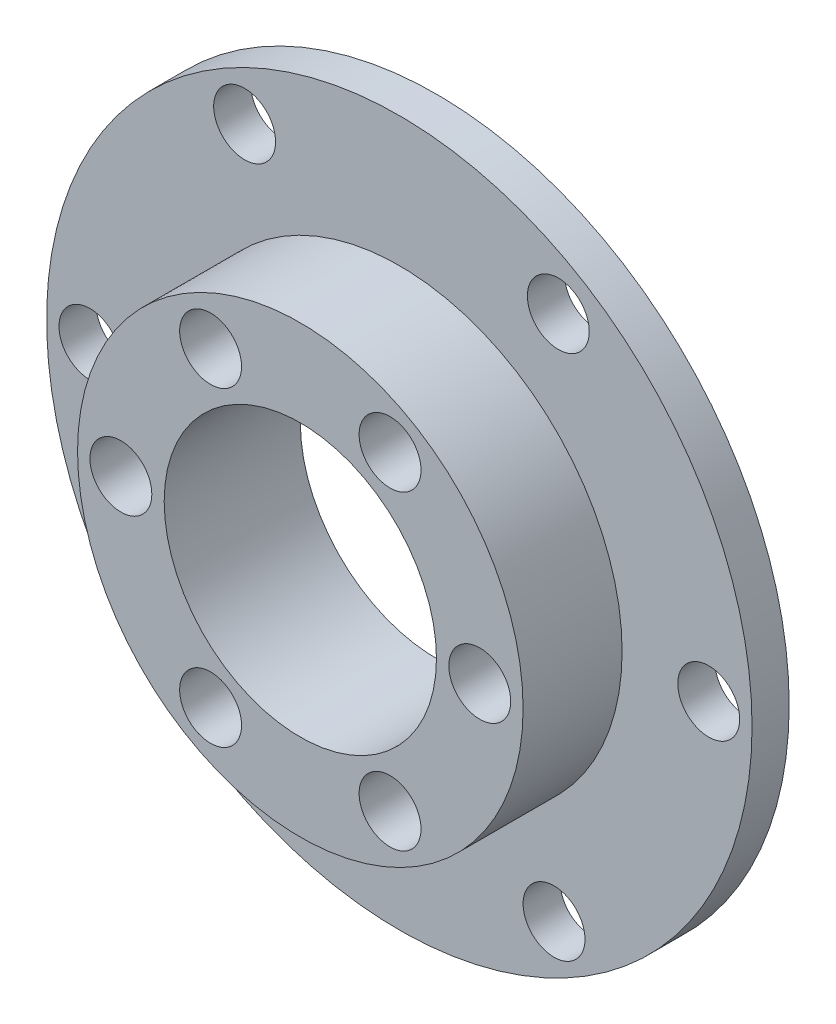
ISO-10303-21;
HEADER;
FILE_DESCRIPTION(('STEP AP214'),'2;1');
FILE_NAME('part.step','',(''),(''),'','','');
FILE_SCHEMA(('AUTOMOTIVE_DESIGN { 1 0 10303 214 1 1 1 1 }'));
ENDSEC;
DATA;
#1=APPLICATION_CONTEXT('core data for automotive mechanical design processes');
#2=APPLICATION_PROTOCOL_DEFINITION('international standard','automotive_design',2000,#1);
#3=PRODUCT_CONTEXT('',#1,'mechanical');
#4=PRODUCT('Part','Part','',(#3));
#5=PRODUCT_RELATED_PRODUCT_CATEGORY('part','',(#4));
#6=PRODUCT_DEFINITION_FORMATION('','',#4);
#7=PRODUCT_DEFINITION_CONTEXT('part definition',#1,'design');
#8=PRODUCT_DEFINITION('design','',#6,#7);
#9=PRODUCT_DEFINITION_SHAPE('','',#8);
#10=(LENGTH_UNIT() NAMED_UNIT(*) SI_UNIT(.MILLI.,.METRE.));
#11=(NAMED_UNIT(*) PLANE_ANGLE_UNIT() SI_UNIT($,.RADIAN.));
#12=(NAMED_UNIT(*) SI_UNIT($,.STERADIAN.) SOLID_ANGLE_UNIT());
#13=UNCERTAINTY_MEASURE_WITH_UNIT(LENGTH_MEASURE(1.E-05),#10,'distance_accuracy_value','');
#14=(GEOMETRIC_REPRESENTATION_CONTEXT(3) GLOBAL_UNCERTAINTY_ASSIGNED_CONTEXT((#13)) GLOBAL_UNIT_ASSIGNED_CONTEXT((#10,
#11,#12)) REPRESENTATION_CONTEXT('',''));
#15=CARTESIAN_POINT('',(0.,0.,0.));
#16=DIRECTION('',(0.,0.,1.));
#17=DIRECTION('',(1.,0.,0.));
#18=AXIS2_PLACEMENT_3D('',#15,#16,#17);
#19=CARTESIAN_POINT('',(0.,0.,3.));
#20=DIRECTION('',(0.,0.,1.));
#21=DIRECTION('',(1.,0.,0.));
#22=AXIS2_PLACEMENT_3D('',#19,#20,#21);
#23=PLANE('',#22);
#24=CARTESIAN_POINT('',(0.,0.,3.));
#25=DIRECTION('',(0.,0.,1.));
#26=DIRECTION('',(1.,0.,0.));
#27=AXIS2_PLACEMENT_3D('',#24,#25,#26);
#28=CIRCLE('',#27,28.5);
#29=CARTESIAN_POINT('',(28.5,0.,3.));
#30=VERTEX_POINT('',#29);
#31=EDGE_CURVE('E10',#30,#30,#28,.T.);
#32=ORIENTED_EDGE('',*,*,#31,.T.);
#33=EDGE_LOOP('',(#32));
#34=FACE_BOUND('',#33,.T.);
#35=CARTESIAN_POINT('',(-12.5000000000003,21.6506350946108,3.));
#36=DIRECTION('',(0.,0.,1.));
#37=DIRECTION('',(1.,0.,0.));
#38=AXIS2_PLACEMENT_3D('',#35,#36,#37);
#39=CIRCLE('',#38,2.5);
#40=CARTESIAN_POINT('',(-10.0000000000003,21.6506350946108,3.));
#41=VERTEX_POINT('',#40);
#42=EDGE_CURVE('E41',#41,#41,#39,.T.);
#43=ORIENTED_EDGE('',*,*,#42,.F.);
#44=EDGE_LOOP('',(#43));
#45=FACE_BOUND('',#44,.T.);
#46=CARTESIAN_POINT('',(-25.,0.,3.));
#47=DIRECTION('',(0.,0.,1.));
#48=DIRECTION('',(1.,0.,0.));
#49=AXIS2_PLACEMENT_3D('',#46,#47,#48);
#50=CIRCLE('',#49,2.5);
#51=CARTESIAN_POINT('',(-22.5,0.,3.));
#52=VERTEX_POINT('',#51);
#53=EDGE_CURVE('E46',#52,#52,#50,.T.);
#54=ORIENTED_EDGE('',*,*,#53,.F.);
#55=EDGE_LOOP('',(#54));
#56=FACE_BOUND('',#55,.T.);
#57=CARTESIAN_POINT('',(12.8460455766763,21.0512665740729,3.));
#58=DIRECTION('',(0.,0.,1.));
#59=DIRECTION('',(1.,0.,0.));
#60=AXIS2_PLACEMENT_3D('',#57,#58,#59);
#61=CIRCLE('',#60,2.5);
#62=CARTESIAN_POINT('',(15.3460455766763,21.0512665740729,3.));
#63=VERTEX_POINT('',#62);
#64=EDGE_CURVE('E108',#63,#63,#61,.T.);
#65=ORIENTED_EDGE('',*,*,#64,.F.);
#66=EDGE_LOOP('',(#65));
#67=FACE_BOUND('',#66,.T.);
#68=CARTESIAN_POINT('',(25.,1.74574066942157E-13,3.));
#69=DIRECTION('',(0.,0.,1.));
#70=DIRECTION('',(1.,0.,0.));
#71=AXIS2_PLACEMENT_3D('',#68,#69,#70);
#72=CIRCLE('',#71,2.5);
#73=CARTESIAN_POINT('',(27.5,1.74574066942157E-13,3.));
#74=VERTEX_POINT('',#73);
#75=EDGE_CURVE('E100',#74,#74,#72,.T.);
#76=ORIENTED_EDGE('',*,*,#75,.F.);
#77=EDGE_LOOP('',(#76));
#78=FACE_BOUND('',#77,.T.);
#79=CARTESIAN_POINT('',(12.5000000000001,-21.6506350946109,3.));
#80=DIRECTION('',(0.,0.,1.));
#81=DIRECTION('',(1.,0.,0.));
#82=AXIS2_PLACEMENT_3D('',#79,#80,#81);
#83=CIRCLE('',#82,2.5);
#84=CARTESIAN_POINT('',(15.0000000000001,-21.6506350946109,3.));
#85=VERTEX_POINT('',#84);
#86=EDGE_CURVE('E95',#85,#85,#83,.T.);
#87=ORIENTED_EDGE('',*,*,#86,.F.);
#88=EDGE_LOOP('',(#87));
#89=FACE_BOUND('',#88,.T.);
#90=CARTESIAN_POINT('',(-12.5,-21.650635094611,3.));
#91=DIRECTION('',(0.,0.,1.));
#92=DIRECTION('',(1.,0.,0.));
#93=AXIS2_PLACEMENT_3D('',#90,#91,#92);
#94=CIRCLE('',#93,2.5);
#95=CARTESIAN_POINT('',(-9.99999999999995,-21.650635094611,3.));
#96=VERTEX_POINT('',#95);
#97=EDGE_CURVE('E91',#96,#96,#94,.T.);
#98=ORIENTED_EDGE('',*,*,#97,.F.);
#99=EDGE_LOOP('',(#98));
#100=FACE_BOUND('',#99,.T.);
#101=CARTESIAN_POINT('',(0.,0.,3.));
#102=DIRECTION('',(0.,0.,1.));
#103=DIRECTION('',(1.,0.,0.));
#104=AXIS2_PLACEMENT_3D('',#101,#102,#103);
#105=CIRCLE('',#104,18.);
#106=CARTESIAN_POINT('',(18.,0.,3.));
#107=VERTEX_POINT('',#106);
#108=EDGE_CURVE('E103',#107,#107,#105,.T.);
#109=ORIENTED_EDGE('',*,*,#108,.F.);
#110=EDGE_LOOP('',(#109));
#111=FACE_BOUND('',#110,.T.);
#112=ADVANCED_FACE('F33',(#34,#45,#56,#67,#78,#89,#100,#111),#23,.T.);
#113=CARTESIAN_POINT('',(7.25000000000006,-12.5573683548743,3.));
#114=DIRECTION('',(0.,0.,-1.));
#115=DIRECTION('',(-1.,0.,0.));
#116=AXIS2_PLACEMENT_3D('',#113,#114,#115);
#117=CYLINDRICAL_SURFACE('',#116,2.5);
#118=CARTESIAN_POINT('',(7.25000000000006,-12.5573683548743,0.));
#119=DIRECTION('',(0.,0.,1.));
#120=DIRECTION('',(1.,0.,0.));
#121=AXIS2_PLACEMENT_3D('',#118,#119,#120);
#122=CIRCLE('',#121,2.5);
#123=CARTESIAN_POINT('',(9.75000000000006,-12.5573683548743,0.));
#124=VERTEX_POINT('',#123);
#125=EDGE_CURVE('E86',#124,#124,#122,.T.);
#126=ORIENTED_EDGE('',*,*,#125,.F.);
#127=EDGE_LOOP('',(#126));
#128=FACE_BOUND('',#127,.T.);
#129=CARTESIAN_POINT('',(7.25000000000006,-12.5573683548743,11.));
#130=DIRECTION('',(0.,0.,1.));
#131=DIRECTION('',(1.,0.,0.));
#132=AXIS2_PLACEMENT_3D('',#129,#130,#131);
#133=CIRCLE('',#132,2.5);
#134=CARTESIAN_POINT('',(9.75000000000006,-12.5573683548743,11.));
#135=VERTEX_POINT('',#134);
#136=EDGE_CURVE('E149',#135,#135,#133,.T.);
#137=ORIENTED_EDGE('',*,*,#136,.T.);
#138=EDGE_LOOP('',(#137));
#139=FACE_BOUND('',#138,.T.);
#140=ADVANCED_FACE('F118',(#128,#139),#117,.F.);
#141=CARTESIAN_POINT('',(14.5,1.01252958826451E-13,3.));
#142=DIRECTION('',(0.,0.,-1.));
#143=DIRECTION('',(-1.,0.,0.));
#144=AXIS2_PLACEMENT_3D('',#141,#142,#143);
#145=CYLINDRICAL_SURFACE('',#144,2.5);
#146=CARTESIAN_POINT('',(14.5,1.01252958826451E-13,0.));
#147=DIRECTION('',(0.,0.,1.));
#148=DIRECTION('',(1.,0.,0.));
#149=AXIS2_PLACEMENT_3D('',#146,#147,#148);
#150=CIRCLE('',#149,2.5);
#151=CARTESIAN_POINT('',(17.,1.01252958826451E-13,0.));
#152=VERTEX_POINT('',#151);
#153=EDGE_CURVE('E84',#152,#152,#150,.T.);
#154=ORIENTED_EDGE('',*,*,#153,.F.);
#155=EDGE_LOOP('',(#154));
#156=FACE_BOUND('',#155,.T.);
#157=CARTESIAN_POINT('',(14.5,1.01252958826451E-13,11.));
#158=DIRECTION('',(0.,0.,1.));
#159=DIRECTION('',(1.,0.,0.));
#160=AXIS2_PLACEMENT_3D('',#157,#158,#159);
#161=CIRCLE('',#160,2.5);
#162=CARTESIAN_POINT('',(17.,1.01252958826451E-13,11.));
#163=VERTEX_POINT('',#162);
#164=EDGE_CURVE('E146',#163,#163,#161,.T.);
#165=ORIENTED_EDGE('',*,*,#164,.T.);
#166=EDGE_LOOP('',(#165));
#167=FACE_BOUND('',#166,.T.);
#168=ADVANCED_FACE('F180',(#156,#167),#145,.F.);
#169=CARTESIAN_POINT('',(-14.5,0.,3.));
#170=DIRECTION('',(0.,0.,-1.));
#171=DIRECTION('',(-1.,0.,0.));
#172=AXIS2_PLACEMENT_3D('',#169,#170,#171);
#173=CYLINDRICAL_SURFACE('',#172,2.5);
#174=CARTESIAN_POINT('',(-14.5,0.,0.));
#175=DIRECTION('',(0.,0.,1.));
#176=DIRECTION('',(1.,0.,0.));
#177=AXIS2_PLACEMENT_3D('',#174,#175,#176);
#178=CIRCLE('',#177,2.5);
#179=CARTESIAN_POINT('',(-12.,0.,0.));
#180=VERTEX_POINT('',#179);
#181=EDGE_CURVE('E81',#180,#180,#178,.T.);
#182=ORIENTED_EDGE('',*,*,#181,.F.);
#183=EDGE_LOOP('',(#182));
#184=FACE_BOUND('',#183,.T.);
#185=CARTESIAN_POINT('',(-14.5,0.,11.));
#186=DIRECTION('',(0.,0.,1.));
#187=DIRECTION('',(1.,0.,0.));
#188=AXIS2_PLACEMENT_3D('',#185,#186,#187);
#189=CIRCLE('',#188,2.5);
#190=CARTESIAN_POINT('',(-12.,0.,11.));
#191=VERTEX_POINT('',#190);
#192=EDGE_CURVE('E133',#191,#191,#189,.T.);
#193=ORIENTED_EDGE('',*,*,#192,.T.);
#194=EDGE_LOOP('',(#193));
#195=FACE_BOUND('',#194,.T.);
#196=ADVANCED_FACE('F184',(#184,#195),#173,.F.);
#197=CARTESIAN_POINT('',(7.24999999999988,12.5573683548744,3.));
#198=DIRECTION('',(0.,0.,-1.));
#199=DIRECTION('',(-1.,0.,0.));
#200=AXIS2_PLACEMENT_3D('',#197,#198,#199);
#201=CYLINDRICAL_SURFACE('',#200,2.5);
#202=CARTESIAN_POINT('',(7.24999999999988,12.5573683548744,0.));
#203=DIRECTION('',(0.,0.,1.));
#204=DIRECTION('',(1.,0.,0.));
#205=AXIS2_PLACEMENT_3D('',#202,#203,#204);
#206=CIRCLE('',#205,2.5);
#207=CARTESIAN_POINT('',(9.74999999999988,12.5573683548744,0.));
#208=VERTEX_POINT('',#207);
#209=EDGE_CURVE('E78',#208,#208,#206,.T.);
#210=ORIENTED_EDGE('',*,*,#209,.F.);
#211=EDGE_LOOP('',(#210));
#212=FACE_BOUND('',#211,.T.);
#213=CARTESIAN_POINT('',(7.24999999999988,12.5573683548744,11.));
#214=DIRECTION('',(0.,0.,1.));
#215=DIRECTION('',(1.,0.,0.));
#216=AXIS2_PLACEMENT_3D('',#213,#214,#215);
#217=CIRCLE('',#216,2.5);
#218=CARTESIAN_POINT('',(9.74999999999988,12.5573683548744,11.));
#219=VERTEX_POINT('',#218);
#220=EDGE_CURVE('E143',#219,#219,#217,.T.);
#221=ORIENTED_EDGE('',*,*,#220,.T.);
#222=EDGE_LOOP('',(#221));
#223=FACE_BOUND('',#222,.T.);
#224=ADVANCED_FACE('F188',(#212,#223),#201,.F.);
#225=CARTESIAN_POINT('',(-7.25000000000015,12.5573683548743,3.));
#226=DIRECTION('',(0.,0.,-1.));
#227=DIRECTION('',(-1.,0.,0.));
#228=AXIS2_PLACEMENT_3D('',#225,#226,#227);
#229=CYLINDRICAL_SURFACE('',#228,2.5);
#230=CARTESIAN_POINT('',(-7.25000000000015,12.5573683548743,0.));
#231=DIRECTION('',(0.,0.,1.));
#232=DIRECTION('',(1.,0.,0.));
#233=AXIS2_PLACEMENT_3D('',#230,#231,#232);
#234=CIRCLE('',#233,2.5);
#235=CARTESIAN_POINT('',(-4.75000000000015,12.5573683548743,0.));
#236=VERTEX_POINT('',#235);
#237=EDGE_CURVE('E75',#236,#236,#234,.T.);
#238=ORIENTED_EDGE('',*,*,#237,.F.);
#239=EDGE_LOOP('',(#238));
#240=FACE_BOUND('',#239,.T.);
#241=CARTESIAN_POINT('',(-7.25000000000015,12.5573683548743,11.));
#242=DIRECTION('',(0.,0.,1.));
#243=DIRECTION('',(1.,0.,0.));
#244=AXIS2_PLACEMENT_3D('',#241,#242,#243);
#245=CIRCLE('',#244,2.5);
#246=CARTESIAN_POINT('',(-4.75000000000015,12.5573683548743,11.));
#247=VERTEX_POINT('',#246);
#248=EDGE_CURVE('E138',#247,#247,#245,.T.);
#249=ORIENTED_EDGE('',*,*,#248,.T.);
#250=EDGE_LOOP('',(#249));
#251=FACE_BOUND('',#250,.T.);
#252=ADVANCED_FACE('F192',(#240,#251),#229,.F.);
#253=CARTESIAN_POINT('',(0.,0.,3.));
#254=DIRECTION('',(0.,0.,-1.));
#255=DIRECTION('',(-1.,0.,0.));
#256=AXIS2_PLACEMENT_3D('',#253,#254,#255);
#257=CYLINDRICAL_SURFACE('',#256,11.);
#258=CARTESIAN_POINT('',(0.,0.,0.));
#259=DIRECTION('',(0.,0.,1.));
#260=DIRECTION('',(1.,0.,0.));
#261=AXIS2_PLACEMENT_3D('',#258,#259,#260);
#262=CIRCLE('',#261,11.);
#263=CARTESIAN_POINT('',(11.,0.,0.));
#264=VERTEX_POINT('',#263);
#265=EDGE_CURVE('E72',#264,#264,#262,.T.);
#266=ORIENTED_EDGE('',*,*,#265,.F.);
#267=EDGE_LOOP('',(#266));
#268=FACE_BOUND('',#267,.T.);
#269=CARTESIAN_POINT('',(0.,0.,11.));
#270=DIRECTION('',(0.,0.,1.));
#271=DIRECTION('',(1.,0.,0.));
#272=AXIS2_PLACEMENT_3D('',#269,#270,#271);
#273=CIRCLE('',#272,11.);
#274=CARTESIAN_POINT('',(11.,0.,11.));
#275=VERTEX_POINT('',#274);
#276=EDGE_CURVE('E130',#275,#275,#273,.T.);
#277=ORIENTED_EDGE('',*,*,#276,.T.);
#278=EDGE_LOOP('',(#277));
#279=FACE_BOUND('',#278,.T.);
#280=ADVANCED_FACE('F196',(#268,#279),#257,.F.);
#281=CARTESIAN_POINT('',(0.,0.,3.));
#282=DIRECTION('',(0.,0.,-1.));
#283=DIRECTION('',(-1.,0.,0.));
#284=AXIS2_PLACEMENT_3D('',#281,#282,#283);
#285=CYLINDRICAL_SURFACE('',#284,28.5);
#286=ORIENTED_EDGE('',*,*,#31,.F.);
#287=EDGE_LOOP('',(#286));
#288=FACE_BOUND('',#287,.T.);
#289=CARTESIAN_POINT('',(0.,0.,0.));
#290=DIRECTION('',(0.,0.,1.));
#291=DIRECTION('',(1.,0.,0.));
#292=AXIS2_PLACEMENT_3D('',#289,#290,#291);
#293=CIRCLE('',#292,28.5);
#294=CARTESIAN_POINT('',(28.5,0.,0.));
#295=VERTEX_POINT('',#294);
#296=EDGE_CURVE('E69',#295,#295,#293,.T.);
#297=ORIENTED_EDGE('',*,*,#296,.T.);
#298=EDGE_LOOP('',(#297));
#299=FACE_BOUND('',#298,.T.);
#300=ADVANCED_FACE('F200',(#288,#299),#285,.T.);
#301=CARTESIAN_POINT('',(-12.5000000000003,21.6506350946108,3.));
#302=DIRECTION('',(0.,0.,-1.));
#303=DIRECTION('',(-1.,0.,0.));
#304=AXIS2_PLACEMENT_3D('',#301,#302,#303);
#305=CYLINDRICAL_SURFACE('',#304,2.5);
#306=ORIENTED_EDGE('',*,*,#42,.T.);
#307=EDGE_LOOP('',(#306));
#308=FACE_BOUND('',#307,.T.);
#309=CARTESIAN_POINT('',(-12.5000000000003,21.6506350946108,0.));
#310=DIRECTION('',(0.,0.,1.));
#311=DIRECTION('',(1.,0.,0.));
#312=AXIS2_PLACEMENT_3D('',#309,#310,#311);
#313=CIRCLE('',#312,2.5);
#314=CARTESIAN_POINT('',(-10.0000000000003,21.6506350946108,0.));
#315=VERTEX_POINT('',#314);
#316=EDGE_CURVE('E66',#315,#315,#313,.T.);
#317=ORIENTED_EDGE('',*,*,#316,.F.);
#318=EDGE_LOOP('',(#317));
#319=FACE_BOUND('',#318,.T.);
#320=ADVANCED_FACE('F204',(#308,#319),#305,.F.);
#321=CARTESIAN_POINT('',(-25.,0.,3.));
#322=DIRECTION('',(0.,0.,-1.));
#323=DIRECTION('',(-1.,0.,0.));
#324=AXIS2_PLACEMENT_3D('',#321,#322,#323);
#325=CYLINDRICAL_SURFACE('',#324,2.5);
#326=ORIENTED_EDGE('',*,*,#53,.T.);
#327=EDGE_LOOP('',(#326));
#328=FACE_BOUND('',#327,.T.);
#329=CARTESIAN_POINT('',(-25.,0.,0.));
#330=DIRECTION('',(0.,0.,1.));
#331=DIRECTION('',(1.,0.,0.));
#332=AXIS2_PLACEMENT_3D('',#329,#330,#331);
#333=CIRCLE('',#332,2.5);
#334=CARTESIAN_POINT('',(-22.5,0.,0.));
#335=VERTEX_POINT('',#334);
#336=EDGE_CURVE('E63',#335,#335,#333,.T.);
#337=ORIENTED_EDGE('',*,*,#336,.F.);
#338=EDGE_LOOP('',(#337));
#339=FACE_BOUND('',#338,.T.);
#340=ADVANCED_FACE('F113',(#328,#339),#325,.F.);
#341=CARTESIAN_POINT('',(12.8460455766763,21.0512665740729,3.));
#342=DIRECTION('',(0.,0.,-1.));
#343=DIRECTION('',(-1.,0.,0.));
#344=AXIS2_PLACEMENT_3D('',#341,#342,#343);
#345=CYLINDRICAL_SURFACE('',#344,2.5);
#346=ORIENTED_EDGE('',*,*,#64,.T.);
#347=EDGE_LOOP('',(#346));
#348=FACE_BOUND('',#347,.T.);
#349=CARTESIAN_POINT('',(12.8460455766763,21.0512665740729,0.));
#350=DIRECTION('',(0.,0.,1.));
#351=DIRECTION('',(1.,0.,0.));
#352=AXIS2_PLACEMENT_3D('',#349,#350,#351);
#353=CIRCLE('',#352,2.5);
#354=CARTESIAN_POINT('',(15.3460455766763,21.0512665740729,0.));
#355=VERTEX_POINT('',#354);
#356=EDGE_CURVE('E60',#355,#355,#353,.T.);
#357=ORIENTED_EDGE('',*,*,#356,.F.);
#358=EDGE_LOOP('',(#357));
#359=FACE_BOUND('',#358,.T.);
#360=ADVANCED_FACE('F211',(#348,#359),#345,.F.);
#361=CARTESIAN_POINT('',(25.,1.74574066942157E-13,3.));
#362=DIRECTION('',(0.,0.,-1.));
#363=DIRECTION('',(-1.,0.,0.));
#364=AXIS2_PLACEMENT_3D('',#361,#362,#363);
#365=CYLINDRICAL_SURFACE('',#364,2.5);
#366=ORIENTED_EDGE('',*,*,#75,.T.);
#367=EDGE_LOOP('',(#366));
#368=FACE_BOUND('',#367,.T.);
#369=CARTESIAN_POINT('',(25.,1.74574066942157E-13,0.));
#370=DIRECTION('',(0.,0.,1.));
#371=DIRECTION('',(1.,0.,0.));
#372=AXIS2_PLACEMENT_3D('',#369,#370,#371);
#373=CIRCLE('',#372,2.5);
#374=CARTESIAN_POINT('',(27.5,1.74574066942157E-13,0.));
#375=VERTEX_POINT('',#374);
#376=EDGE_CURVE('E57',#375,#375,#373,.T.);
#377=ORIENTED_EDGE('',*,*,#376,.F.);
#378=EDGE_LOOP('',(#377));
#379=FACE_BOUND('',#378,.T.);
#380=ADVANCED_FACE('F214',(#368,#379),#365,.F.);
#381=CARTESIAN_POINT('',(12.5000000000001,-21.6506350946109,3.));
#382=DIRECTION('',(0.,0.,-1.));
#383=DIRECTION('',(-1.,0.,0.));
#384=AXIS2_PLACEMENT_3D('',#381,#382,#383);
#385=CYLINDRICAL_SURFACE('',#384,2.5);
#386=ORIENTED_EDGE('',*,*,#86,.T.);
#387=EDGE_LOOP('',(#386));
#388=FACE_BOUND('',#387,.T.);
#389=CARTESIAN_POINT('',(12.5000000000001,-21.6506350946109,0.));
#390=DIRECTION('',(0.,0.,1.));
#391=DIRECTION('',(1.,0.,0.));
#392=AXIS2_PLACEMENT_3D('',#389,#390,#391);
#393=CIRCLE('',#392,2.5);
#394=CARTESIAN_POINT('',(15.0000000000001,-21.6506350946109,0.));
#395=VERTEX_POINT('',#394);
#396=EDGE_CURVE('E53',#395,#395,#393,.T.);
#397=ORIENTED_EDGE('',*,*,#396,.F.);
#398=EDGE_LOOP('',(#397));
#399=FACE_BOUND('',#398,.T.);
#400=ADVANCED_FACE('F217',(#388,#399),#385,.F.);
#401=CARTESIAN_POINT('',(-12.5,-21.650635094611,3.));
#402=DIRECTION('',(0.,0.,-1.));
#403=DIRECTION('',(-1.,0.,0.));
#404=AXIS2_PLACEMENT_3D('',#401,#402,#403);
#405=CYLINDRICAL_SURFACE('',#404,2.5);
#406=ORIENTED_EDGE('',*,*,#97,.T.);
#407=EDGE_LOOP('',(#406));
#408=FACE_BOUND('',#407,.T.);
#409=CARTESIAN_POINT('',(-12.5,-21.650635094611,0.));
#410=DIRECTION('',(0.,0.,1.));
#411=DIRECTION('',(1.,0.,0.));
#412=AXIS2_PLACEMENT_3D('',#409,#410,#411);
#413=CIRCLE('',#412,2.5);
#414=CARTESIAN_POINT('',(-9.99999999999995,-21.650635094611,0.));
#415=VERTEX_POINT('',#414);
#416=EDGE_CURVE('E50',#415,#415,#413,.T.);
#417=ORIENTED_EDGE('',*,*,#416,.F.);
#418=EDGE_LOOP('',(#417));
#419=FACE_BOUND('',#418,.T.);
#420=ADVANCED_FACE('F35',(#408,#419),#405,.F.);
#421=CARTESIAN_POINT('',(-7.24999999999997,-12.5573683548744,3.));
#422=DIRECTION('',(0.,0.,-1.));
#423=DIRECTION('',(-1.,0.,0.));
#424=AXIS2_PLACEMENT_3D('',#421,#422,#423);
#425=CYLINDRICAL_SURFACE('',#424,2.5);
#426=CARTESIAN_POINT('',(-7.24999999999997,-12.5573683548744,0.));
#427=DIRECTION('',(0.,0.,1.));
#428=DIRECTION('',(1.,0.,0.));
#429=AXIS2_PLACEMENT_3D('',#426,#427,#428);
#430=CIRCLE('',#429,2.5);
#431=CARTESIAN_POINT('',(-4.74999999999997,-12.5573683548744,0.));
#432=VERTEX_POINT('',#431);
#433=EDGE_CURVE('E37',#432,#432,#430,.T.);
#434=ORIENTED_EDGE('',*,*,#433,.F.);
#435=EDGE_LOOP('',(#434));
#436=FACE_BOUND('',#435,.T.);
#437=CARTESIAN_POINT('',(-7.24999999999997,-12.5573683548744,11.));
#438=DIRECTION('',(0.,0.,1.));
#439=DIRECTION('',(1.,0.,0.));
#440=AXIS2_PLACEMENT_3D('',#437,#438,#439);
#441=CIRCLE('',#440,2.5);
#442=CARTESIAN_POINT('',(-4.74999999999997,-12.5573683548744,11.));
#443=VERTEX_POINT('',#442);
#444=EDGE_CURVE('E152',#443,#443,#441,.T.);
#445=ORIENTED_EDGE('',*,*,#444,.T.);
#446=EDGE_LOOP('',(#445));
#447=FACE_BOUND('',#446,.T.);
#448=ADVANCED_FACE('F156',(#436,#447),#425,.F.);
#449=CARTESIAN_POINT('',(0.,0.,0.));
#450=DIRECTION('',(0.,0.,1.));
#451=DIRECTION('',(1.,0.,0.));
#452=AXIS2_PLACEMENT_3D('',#449,#450,#451);
#453=PLANE('',#452);
#454=ORIENTED_EDGE('',*,*,#416,.T.);
#455=EDGE_LOOP('',(#454));
#456=FACE_BOUND('',#455,.T.);
#457=ORIENTED_EDGE('',*,*,#396,.T.);
#458=EDGE_LOOP('',(#457));
#459=FACE_BOUND('',#458,.T.);
#460=ORIENTED_EDGE('',*,*,#376,.T.);
#461=EDGE_LOOP('',(#460));
#462=FACE_BOUND('',#461,.T.);
#463=ORIENTED_EDGE('',*,*,#356,.T.);
#464=EDGE_LOOP('',(#463));
#465=FACE_BOUND('',#464,.T.);
#466=ORIENTED_EDGE('',*,*,#336,.T.);
#467=EDGE_LOOP('',(#466));
#468=FACE_BOUND('',#467,.T.);
#469=ORIENTED_EDGE('',*,*,#316,.T.);
#470=EDGE_LOOP('',(#469));
#471=FACE_BOUND('',#470,.T.);
#472=ORIENTED_EDGE('',*,*,#296,.F.);
#473=EDGE_LOOP('',(#472));
#474=FACE_BOUND('',#473,.T.);
#475=ORIENTED_EDGE('',*,*,#265,.T.);
#476=EDGE_LOOP('',(#475));
#477=FACE_BOUND('',#476,.T.);
#478=ORIENTED_EDGE('',*,*,#237,.T.);
#479=EDGE_LOOP('',(#478));
#480=FACE_BOUND('',#479,.T.);
#481=ORIENTED_EDGE('',*,*,#209,.T.);
#482=EDGE_LOOP('',(#481));
#483=FACE_BOUND('',#482,.T.);
#484=ORIENTED_EDGE('',*,*,#181,.T.);
#485=EDGE_LOOP('',(#484));
#486=FACE_BOUND('',#485,.T.);
#487=ORIENTED_EDGE('',*,*,#153,.T.);
#488=EDGE_LOOP('',(#487));
#489=FACE_BOUND('',#488,.T.);
#490=ORIENTED_EDGE('',*,*,#125,.T.);
#491=EDGE_LOOP('',(#490));
#492=FACE_BOUND('',#491,.T.);
#493=ORIENTED_EDGE('',*,*,#433,.T.);
#494=EDGE_LOOP('',(#493));
#495=FACE_BOUND('',#494,.T.);
#496=ADVANCED_FACE('F161',(#456,#459,#462,#465,#468,#471,#474,#477,#480,#483,#486,#489,#492,
#495),#453,.F.);
#497=CARTESIAN_POINT('',(0.,0.,11.));
#498=DIRECTION('',(0.,0.,1.));
#499=DIRECTION('',(1.,0.,0.));
#500=AXIS2_PLACEMENT_3D('',#497,#498,#499);
#501=PLANE('',#500);
#502=ORIENTED_EDGE('',*,*,#136,.F.);
#503=EDGE_LOOP('',(#502));
#504=FACE_BOUND('',#503,.T.);
#505=ORIENTED_EDGE('',*,*,#220,.F.);
#506=EDGE_LOOP('',(#505));
#507=FACE_BOUND('',#506,.T.);
#508=ORIENTED_EDGE('',*,*,#192,.F.);
#509=EDGE_LOOP('',(#508));
#510=FACE_BOUND('',#509,.T.);
#511=CARTESIAN_POINT('',(0.,0.,11.));
#512=DIRECTION('',(0.,0.,1.));
#513=DIRECTION('',(1.,0.,0.));
#514=AXIS2_PLACEMENT_3D('',#511,#512,#513);
#515=CIRCLE('',#514,18.);
#516=CARTESIAN_POINT('',(18.,0.,11.));
#517=VERTEX_POINT('',#516);
#518=EDGE_CURVE('E54',#517,#517,#515,.T.);
#519=ORIENTED_EDGE('',*,*,#518,.T.);
#520=EDGE_LOOP('',(#519));
#521=FACE_BOUND('',#520,.T.);
#522=ORIENTED_EDGE('',*,*,#276,.F.);
#523=EDGE_LOOP('',(#522));
#524=FACE_BOUND('',#523,.T.);
#525=ORIENTED_EDGE('',*,*,#248,.F.);
#526=EDGE_LOOP('',(#525));
#527=FACE_BOUND('',#526,.T.);
#528=ORIENTED_EDGE('',*,*,#164,.F.);
#529=EDGE_LOOP('',(#528));
#530=FACE_BOUND('',#529,.T.);
#531=ORIENTED_EDGE('',*,*,#444,.F.);
#532=EDGE_LOOP('',(#531));
#533=FACE_BOUND('',#532,.T.);
#534=ADVANCED_FACE('F158',(#504,#507,#510,#521,#524,#527,#530,#533),#501,.T.);
#535=CARTESIAN_POINT('',(0.,0.,11.));
#536=DIRECTION('',(0.,0.,-1.));
#537=DIRECTION('',(-1.,0.,0.));
#538=AXIS2_PLACEMENT_3D('',#535,#536,#537);
#539=CYLINDRICAL_SURFACE('',#538,18.);
#540=ORIENTED_EDGE('',*,*,#518,.F.);
#541=EDGE_LOOP('',(#540));
#542=FACE_BOUND('',#541,.T.);
#543=ORIENTED_EDGE('',*,*,#108,.T.);
#544=EDGE_LOOP('',(#543));
#545=FACE_BOUND('',#544,.T.);
#546=ADVANCED_FACE('F160',(#542,#545),#539,.T.);
#547=CLOSED_SHELL('',(#112,#140,#168,#196,#224,#252,#280,#300,#320,#340,#360,#380,#400,#420,
#448,#496,#534,#546));
#548=MANIFOLD_SOLID_BREP('B2',#547);
#549=ADVANCED_BREP_SHAPE_REPRESENTATION('',(#18,#548),#14);
#550=SHAPE_DEFINITION_REPRESENTATION(#9,#549);
ENDSEC;
END-ISO-10303-21;
